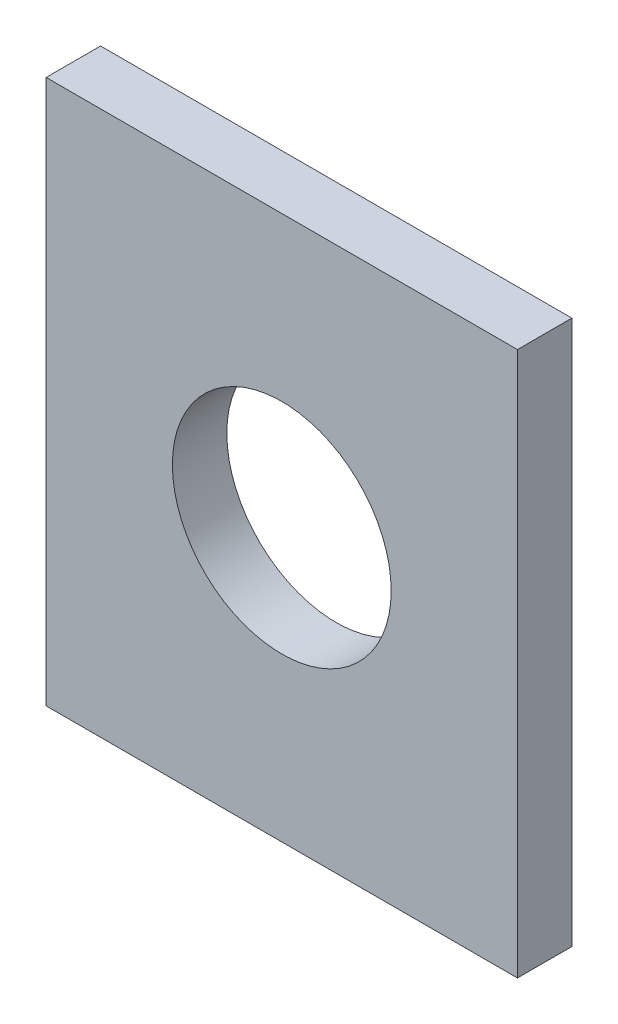
ISO-10303-21;
HEADER;
FILE_DESCRIPTION(('STEP AP214'),'2;1');
FILE_NAME('part.step','',(''),(''),'','','');
FILE_SCHEMA(('AUTOMOTIVE_DESIGN { 1 0 10303 214 1 1 1 1 }'));
ENDSEC;
DATA;
#1=APPLICATION_CONTEXT('core data for automotive mechanical design processes');
#2=APPLICATION_PROTOCOL_DEFINITION('international standard','automotive_design',2000,#1);
#3=PRODUCT_CONTEXT('',#1,'mechanical');
#4=PRODUCT('Part','Part','',(#3));
#5=PRODUCT_RELATED_PRODUCT_CATEGORY('part','',(#4));
#6=PRODUCT_DEFINITION_FORMATION('','',#4);
#7=PRODUCT_DEFINITION_CONTEXT('part definition',#1,'design');
#8=PRODUCT_DEFINITION('design','',#6,#7);
#9=PRODUCT_DEFINITION_SHAPE('','',#8);
#10=(LENGTH_UNIT() NAMED_UNIT(*) SI_UNIT(.MILLI.,.METRE.));
#11=(NAMED_UNIT(*) PLANE_ANGLE_UNIT() SI_UNIT($,.RADIAN.));
#12=(NAMED_UNIT(*) SI_UNIT($,.STERADIAN.) SOLID_ANGLE_UNIT());
#13=UNCERTAINTY_MEASURE_WITH_UNIT(LENGTH_MEASURE(1.E-05),#10,'distance_accuracy_value','');
#14=(GEOMETRIC_REPRESENTATION_CONTEXT(3) GLOBAL_UNCERTAINTY_ASSIGNED_CONTEXT((#13)) GLOBAL_UNIT_ASSIGNED_CONTEXT((#10,
#11,#12)) REPRESENTATION_CONTEXT('',''));
#15=CARTESIAN_POINT('',(0.,0.,0.));
#16=DIRECTION('',(0.,0.,1.));
#17=DIRECTION('',(1.,0.,0.));
#18=AXIS2_PLACEMENT_3D('',#15,#16,#17);
#19=CARTESIAN_POINT('',(0.,0.,2.54));
#20=DIRECTION('',(0.,0.,-1.));
#21=DIRECTION('',(-1.,0.,0.));
#22=AXIS2_PLACEMENT_3D('',#19,#20,#21);
#23=PLANE('',#22);
#24=DIRECTION('',(0.,1.,0.));
#25=VECTOR('',#24,1.);
#26=CARTESIAN_POINT('',(10.9982,-12.7,2.54));
#27=LINE('',#26,#25);
#28=CARTESIAN_POINT('',(10.9982,-12.7,2.54));
#29=VERTEX_POINT('',#28);
#30=CARTESIAN_POINT('',(10.9982,12.7,2.54));
#31=VERTEX_POINT('',#30);
#32=EDGE_CURVE('E85',#29,#31,#27,.T.);
#33=ORIENTED_EDGE('',*,*,#32,.T.);
#34=DIRECTION('',(-1.,0.,0.));
#35=VECTOR('',#34,1.);
#36=CARTESIAN_POINT('',(-10.9982,12.7,2.54));
#37=LINE('',#36,#35);
#38=CARTESIAN_POINT('',(-10.9982,12.7,2.54));
#39=VERTEX_POINT('',#38);
#40=EDGE_CURVE('E80',#31,#39,#37,.T.);
#41=ORIENTED_EDGE('',*,*,#40,.T.);
#42=DIRECTION('',(0.,-1.,0.));
#43=VECTOR('',#42,1.);
#44=CARTESIAN_POINT('',(-10.9982,-12.7,2.54));
#45=LINE('',#44,#43);
#46=CARTESIAN_POINT('',(-10.9982,-12.7,2.54));
#47=VERTEX_POINT('',#46);
#48=EDGE_CURVE('E83',#39,#47,#45,.T.);
#49=ORIENTED_EDGE('',*,*,#48,.T.);
#50=DIRECTION('',(1.,0.,0.));
#51=VECTOR('',#50,1.);
#52=CARTESIAN_POINT('',(-10.9982,-12.7,2.54));
#53=LINE('',#52,#51);
#54=EDGE_CURVE('E50',#47,#29,#53,.T.);
#55=ORIENTED_EDGE('',*,*,#54,.T.);
#56=EDGE_LOOP('',(#33,#41,#49,#55));
#57=FACE_BOUND('',#56,.T.);
#58=CARTESIAN_POINT('',(0.,0.,2.54));
#59=DIRECTION('',(0.,0.,1.));
#60=DIRECTION('',(1.,0.,0.));
#61=AXIS2_PLACEMENT_3D('',#58,#59,#60);
#62=CIRCLE('',#61,5.1054);
#63=CARTESIAN_POINT('',(5.1054,0.,2.54));
#64=VERTEX_POINT('',#63);
#65=EDGE_CURVE('E100',#64,#64,#62,.T.);
#66=ORIENTED_EDGE('',*,*,#65,.F.);
#67=EDGE_LOOP('',(#66));
#68=FACE_BOUND('',#67,.T.);
#69=ADVANCED_FACE('F33',(#57,#68),#23,.F.);
#70=CARTESIAN_POINT('',(0.,0.,0.));
#71=DIRECTION('',(0.,0.,-1.));
#72=DIRECTION('',(-1.,0.,0.));
#73=AXIS2_PLACEMENT_3D('',#70,#71,#72);
#74=PLANE('',#73);
#75=DIRECTION('',(0.,1.,0.));
#76=VECTOR('',#75,1.);
#77=CARTESIAN_POINT('',(10.9982,-12.7,0.));
#78=LINE('',#77,#76);
#79=CARTESIAN_POINT('',(10.9982,-12.7,0.));
#80=VERTEX_POINT('',#79);
#81=CARTESIAN_POINT('',(10.9982,12.7,0.));
#82=VERTEX_POINT('',#81);
#83=EDGE_CURVE('E97',#80,#82,#78,.T.);
#84=ORIENTED_EDGE('',*,*,#83,.F.);
#85=DIRECTION('',(1.,0.,0.));
#86=VECTOR('',#85,1.);
#87=CARTESIAN_POINT('',(-10.9982,-12.7,0.));
#88=LINE('',#87,#86);
#89=CARTESIAN_POINT('',(-10.9982,-12.7,0.));
#90=VERTEX_POINT('',#89);
#91=EDGE_CURVE('E73',#90,#80,#88,.T.);
#92=ORIENTED_EDGE('',*,*,#91,.F.);
#93=DIRECTION('',(0.,-1.,0.));
#94=VECTOR('',#93,1.);
#95=CARTESIAN_POINT('',(-10.9982,-12.7,0.));
#96=LINE('',#95,#94);
#97=CARTESIAN_POINT('',(-10.9982,12.7,0.));
#98=VERTEX_POINT('',#97);
#99=EDGE_CURVE('E67',#98,#90,#96,.T.);
#100=ORIENTED_EDGE('',*,*,#99,.F.);
#101=DIRECTION('',(-1.,0.,0.));
#102=VECTOR('',#101,1.);
#103=CARTESIAN_POINT('',(-10.9982,12.7,0.));
#104=LINE('',#103,#102);
#105=EDGE_CURVE('E89',#82,#98,#104,.T.);
#106=ORIENTED_EDGE('',*,*,#105,.F.);
#107=EDGE_LOOP('',(#84,#92,#100,#106));
#108=FACE_BOUND('',#107,.T.);
#109=CARTESIAN_POINT('',(0.,0.,0.));
#110=DIRECTION('',(0.,0.,1.));
#111=DIRECTION('',(1.,0.,0.));
#112=AXIS2_PLACEMENT_3D('',#109,#110,#111);
#113=CIRCLE('',#112,5.1054);
#114=CARTESIAN_POINT('',(5.1054,0.,0.));
#115=VERTEX_POINT('',#114);
#116=EDGE_CURVE('E112',#115,#115,#113,.T.);
#117=ORIENTED_EDGE('',*,*,#116,.T.);
#118=EDGE_LOOP('',(#117));
#119=FACE_BOUND('',#118,.T.);
#120=ADVANCED_FACE('F108',(#108,#119),#74,.T.);
#121=CARTESIAN_POINT('',(10.9982,-12.7,2.54));
#122=DIRECTION('',(-1.,0.,0.));
#123=DIRECTION('',(0.,0.,1.));
#124=AXIS2_PLACEMENT_3D('',#121,#122,#123);
#125=PLANE('',#124);
#126=ORIENTED_EDGE('',*,*,#83,.T.);
#127=DIRECTION('',(0.,0.,-1.));
#128=VECTOR('',#127,1.);
#129=CARTESIAN_POINT('',(10.9982,12.7,2.54));
#130=LINE('',#129,#128);
#131=EDGE_CURVE('E11',#31,#82,#130,.T.);
#132=ORIENTED_EDGE('',*,*,#131,.F.);
#133=ORIENTED_EDGE('',*,*,#32,.F.);
#134=DIRECTION('',(0.,0.,-1.));
#135=VECTOR('',#134,1.);
#136=CARTESIAN_POINT('',(10.9982,-12.7,2.54));
#137=LINE('',#136,#135);
#138=EDGE_CURVE('E93',#29,#80,#137,.T.);
#139=ORIENTED_EDGE('',*,*,#138,.T.);
#140=EDGE_LOOP('',(#126,#132,#133,#139));
#141=FACE_BOUND('',#140,.T.);
#142=ADVANCED_FACE('F35',(#141),#125,.F.);
#143=CARTESIAN_POINT('',(-10.9982,12.7,2.54));
#144=DIRECTION('',(0.,-1.,0.));
#145=DIRECTION('',(0.,0.,-1.));
#146=AXIS2_PLACEMENT_3D('',#143,#144,#145);
#147=PLANE('',#146);
#148=ORIENTED_EDGE('',*,*,#105,.T.);
#149=DIRECTION('',(0.,0.,-1.));
#150=VECTOR('',#149,1.);
#151=CARTESIAN_POINT('',(-10.9982,12.7,2.54));
#152=LINE('',#151,#150);
#153=EDGE_CURVE('E42',#39,#98,#152,.T.);
#154=ORIENTED_EDGE('',*,*,#153,.F.);
#155=ORIENTED_EDGE('',*,*,#40,.F.);
#156=ORIENTED_EDGE('',*,*,#131,.T.);
#157=EDGE_LOOP('',(#148,#154,#155,#156));
#158=FACE_BOUND('',#157,.T.);
#159=ADVANCED_FACE('F88',(#158),#147,.F.);
#160=CARTESIAN_POINT('',(-10.9982,-12.7,2.54));
#161=DIRECTION('',(1.,0.,0.));
#162=DIRECTION('',(0.,0.,-1.));
#163=AXIS2_PLACEMENT_3D('',#160,#161,#162);
#164=PLANE('',#163);
#165=ORIENTED_EDGE('',*,*,#99,.T.);
#166=DIRECTION('',(0.,0.,-1.));
#167=VECTOR('',#166,1.);
#168=CARTESIAN_POINT('',(-10.9982,-12.7,2.54));
#169=LINE('',#168,#167);
#170=EDGE_CURVE('E90',#47,#90,#169,.T.);
#171=ORIENTED_EDGE('',*,*,#170,.F.);
#172=ORIENTED_EDGE('',*,*,#48,.F.);
#173=ORIENTED_EDGE('',*,*,#153,.T.);
#174=EDGE_LOOP('',(#165,#171,#172,#173));
#175=FACE_BOUND('',#174,.T.);
#176=ADVANCED_FACE('F91',(#175),#164,.F.);
#177=CARTESIAN_POINT('',(-10.9982,-12.7,2.54));
#178=DIRECTION('',(0.,1.,0.));
#179=DIRECTION('',(0.,0.,1.));
#180=AXIS2_PLACEMENT_3D('',#177,#178,#179);
#181=PLANE('',#180);
#182=ORIENTED_EDGE('',*,*,#91,.T.);
#183=ORIENTED_EDGE('',*,*,#138,.F.);
#184=ORIENTED_EDGE('',*,*,#54,.F.);
#185=ORIENTED_EDGE('',*,*,#170,.T.);
#186=EDGE_LOOP('',(#182,#183,#184,#185));
#187=FACE_BOUND('',#186,.T.);
#188=ADVANCED_FACE('F105',(#187),#181,.F.);
#189=CARTESIAN_POINT('',(0.,0.,2.54));
#190=DIRECTION('',(0.,0.,-1.));
#191=DIRECTION('',(-1.,0.,0.));
#192=AXIS2_PLACEMENT_3D('',#189,#190,#191);
#193=CYLINDRICAL_SURFACE('',#192,5.1054);
#194=ORIENTED_EDGE('',*,*,#65,.T.);
#195=EDGE_LOOP('',(#194));
#196=FACE_BOUND('',#195,.T.);
#197=ORIENTED_EDGE('',*,*,#116,.F.);
#198=EDGE_LOOP('',(#197));
#199=FACE_BOUND('',#198,.T.);
#200=ADVANCED_FACE('F118',(#196,#199),#193,.F.);
#201=CLOSED_SHELL('',(#69,#120,#142,#159,#176,#188,#200));
#202=MANIFOLD_SOLID_BREP('B2',#201);
#203=ADVANCED_BREP_SHAPE_REPRESENTATION('',(#18,#202),#14);
#204=SHAPE_DEFINITION_REPRESENTATION(#9,#203);
ENDSEC;
END-ISO-10303-21;
